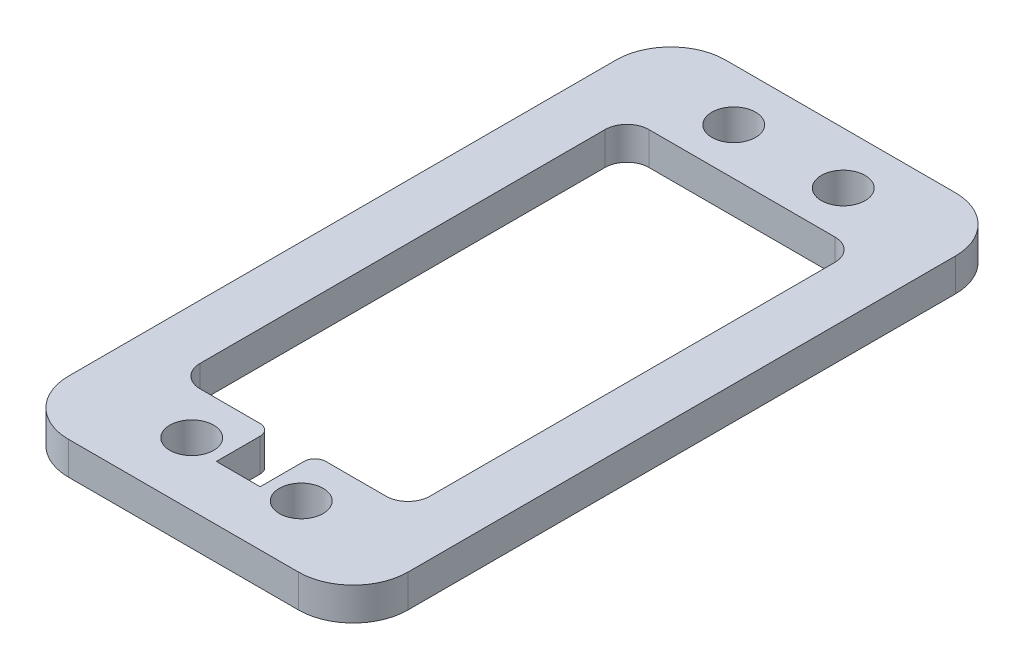
ISO-10303-21;
HEADER;
FILE_DESCRIPTION(('STEP AP214'),'2;1');
FILE_NAME('part.step','',(''),(''),'','','');
FILE_SCHEMA(('AUTOMOTIVE_DESIGN { 1 0 10303 214 1 1 1 1 }'));
ENDSEC;
DATA;
#1=APPLICATION_CONTEXT('core data for automotive mechanical design processes');
#2=APPLICATION_PROTOCOL_DEFINITION('international standard','automotive_design',2000,#1);
#3=PRODUCT_CONTEXT('',#1,'mechanical');
#4=PRODUCT('Part','Part','',(#3));
#5=PRODUCT_RELATED_PRODUCT_CATEGORY('part','',(#4));
#6=PRODUCT_DEFINITION_FORMATION('','',#4);
#7=PRODUCT_DEFINITION_CONTEXT('part definition',#1,'design');
#8=PRODUCT_DEFINITION('design','',#6,#7);
#9=PRODUCT_DEFINITION_SHAPE('','',#8);
#10=(LENGTH_UNIT() NAMED_UNIT(*) SI_UNIT(.MILLI.,.METRE.));
#11=(NAMED_UNIT(*) PLANE_ANGLE_UNIT() SI_UNIT($,.RADIAN.));
#12=(NAMED_UNIT(*) SI_UNIT($,.STERADIAN.) SOLID_ANGLE_UNIT());
#13=UNCERTAINTY_MEASURE_WITH_UNIT(LENGTH_MEASURE(1.E-05),#10,'distance_accuracy_value','');
#14=(GEOMETRIC_REPRESENTATION_CONTEXT(3) GLOBAL_UNCERTAINTY_ASSIGNED_CONTEXT((#13)) GLOBAL_UNIT_ASSIGNED_CONTEXT((#10,
#11,#12)) REPRESENTATION_CONTEXT('',''));
#15=CARTESIAN_POINT('',(0.,0.,0.));
#16=DIRECTION('',(0.,0.,1.));
#17=DIRECTION('',(1.,0.,0.));
#18=AXIS2_PLACEMENT_3D('',#15,#16,#17);
#19=CARTESIAN_POINT('',(-10.5,3.,-34.4));
#20=DIRECTION('',(0.,-1.,0.));
#21=DIRECTION('',(0.,0.,-1.));
#22=AXIS2_PLACEMENT_3D('',#19,#20,#21);
#23=CYLINDRICAL_SURFACE('',#22,5.);
#24=CARTESIAN_POINT('',(-10.5,0.,-34.4));
#25=DIRECTION('',(0.,1.,0.));
#26=DIRECTION('',(0.,0.,1.));
#27=AXIS2_PLACEMENT_3D('',#24,#25,#26);
#28=CIRCLE('',#27,5.);
#29=CARTESIAN_POINT('',(-15.5,0.,-34.4));
#30=VERTEX_POINT('',#29);
#31=CARTESIAN_POINT('',(-10.5,0.,-39.4));
#32=VERTEX_POINT('',#31);
#33=EDGE_CURVE('E274',#30,#32,#28,.F.);
#34=ORIENTED_EDGE('',*,*,#33,.F.);
#35=DIRECTION('',(0.,-1.,0.));
#36=VECTOR('',#35,1.);
#37=CARTESIAN_POINT('',(-15.5,3.,-34.4));
#38=LINE('',#37,#36);
#39=CARTESIAN_POINT('',(-15.5,3.,-34.4));
#40=VERTEX_POINT('',#39);
#41=EDGE_CURVE('E11',#40,#30,#38,.T.);
#42=ORIENTED_EDGE('',*,*,#41,.F.);
#43=CARTESIAN_POINT('',(-10.5,3.,-34.4));
#44=DIRECTION('',(0.,1.,0.));
#45=DIRECTION('',(0.,0.,1.));
#46=AXIS2_PLACEMENT_3D('',#43,#44,#45);
#47=CIRCLE('',#46,5.);
#48=CARTESIAN_POINT('',(-10.5,3.,-39.4));
#49=VERTEX_POINT('',#48);
#50=EDGE_CURVE('E387',#40,#49,#47,.F.);
#51=ORIENTED_EDGE('',*,*,#50,.T.);
#52=DIRECTION('',(0.,-1.,0.));
#53=VECTOR('',#52,1.);
#54=CARTESIAN_POINT('',(-10.5,3.,-39.4));
#55=LINE('',#54,#53);
#56=EDGE_CURVE('E53',#49,#32,#55,.T.);
#57=ORIENTED_EDGE('',*,*,#56,.T.);
#58=EDGE_LOOP('',(#34,#42,#51,#57));
#59=FACE_BOUND('',#58,.T.);
#60=ADVANCED_FACE('F34',(#59),#23,.T.);
#61=CARTESIAN_POINT('',(-15.5,3.,0.));
#62=DIRECTION('',(1.,0.,0.));
#63=DIRECTION('',(0.,0.,-1.));
#64=AXIS2_PLACEMENT_3D('',#61,#62,#63);
#65=PLANE('',#64);
#66=DIRECTION('',(0.,0.,1.));
#67=VECTOR('',#66,1.);
#68=CARTESIAN_POINT('',(-15.5,0.,0.));
#69=LINE('',#68,#67);
#70=CARTESIAN_POINT('',(-15.5,0.,15.6));
#71=VERTEX_POINT('',#70);
#72=EDGE_CURVE('E276',#30,#71,#69,.T.);
#73=ORIENTED_EDGE('',*,*,#72,.T.);
#74=DIRECTION('',(0.,-1.,0.));
#75=VECTOR('',#74,1.);
#76=CARTESIAN_POINT('',(-15.5,3.,15.6));
#77=LINE('',#76,#75);
#78=CARTESIAN_POINT('',(-15.5,3.,15.6));
#79=VERTEX_POINT('',#78);
#80=EDGE_CURVE('E44',#79,#71,#77,.T.);
#81=ORIENTED_EDGE('',*,*,#80,.F.);
#82=DIRECTION('',(0.,0.,1.));
#83=VECTOR('',#82,1.);
#84=CARTESIAN_POINT('',(-15.5,3.,0.));
#85=LINE('',#84,#83);
#86=EDGE_CURVE('E389',#40,#79,#85,.T.);
#87=ORIENTED_EDGE('',*,*,#86,.F.);
#88=ORIENTED_EDGE('',*,*,#41,.T.);
#89=EDGE_LOOP('',(#73,#81,#87,#88));
#90=FACE_BOUND('',#89,.T.);
#91=ADVANCED_FACE('F416',(#90),#65,.F.);
#92=CARTESIAN_POINT('',(-10.5,3.,15.6));
#93=DIRECTION('',(0.,-1.,0.));
#94=DIRECTION('',(0.,0.,-1.));
#95=AXIS2_PLACEMENT_3D('',#92,#93,#94);
#96=CYLINDRICAL_SURFACE('',#95,5.);
#97=CARTESIAN_POINT('',(-10.5,0.,15.6));
#98=DIRECTION('',(0.,1.,0.));
#99=DIRECTION('',(0.,0.,1.));
#100=AXIS2_PLACEMENT_3D('',#97,#98,#99);
#101=CIRCLE('',#100,5.);
#102=CARTESIAN_POINT('',(-10.5,0.,20.6));
#103=VERTEX_POINT('',#102);
#104=EDGE_CURVE('E279',#71,#103,#101,.T.);
#105=ORIENTED_EDGE('',*,*,#104,.T.);
#106=DIRECTION('',(0.,-1.,0.));
#107=VECTOR('',#106,1.);
#108=CARTESIAN_POINT('',(-10.5,3.,20.6));
#109=LINE('',#108,#107);
#110=CARTESIAN_POINT('',(-10.5,3.,20.6));
#111=VERTEX_POINT('',#110);
#112=EDGE_CURVE('E300',#111,#103,#109,.T.);
#113=ORIENTED_EDGE('',*,*,#112,.F.);
#114=CARTESIAN_POINT('',(-10.5,3.,15.6));
#115=DIRECTION('',(0.,1.,0.));
#116=DIRECTION('',(0.,0.,1.));
#117=AXIS2_PLACEMENT_3D('',#114,#115,#116);
#118=CIRCLE('',#117,5.);
#119=EDGE_CURVE('E392',#79,#111,#118,.T.);
#120=ORIENTED_EDGE('',*,*,#119,.F.);
#121=ORIENTED_EDGE('',*,*,#80,.T.);
#122=EDGE_LOOP('',(#105,#113,#120,#121));
#123=FACE_BOUND('',#122,.T.);
#124=ADVANCED_FACE('F421',(#123),#96,.T.);
#125=CARTESIAN_POINT('',(0.,3.,20.6));
#126=DIRECTION('',(0.,0.,-1.));
#127=DIRECTION('',(-1.,0.,0.));
#128=AXIS2_PLACEMENT_3D('',#125,#126,#127);
#129=PLANE('',#128);
#130=DIRECTION('',(1.,0.,0.));
#131=VECTOR('',#130,1.);
#132=CARTESIAN_POINT('',(0.,0.,20.6));
#133=LINE('',#132,#131);
#134=CARTESIAN_POINT('',(10.5,0.,20.6));
#135=VERTEX_POINT('',#134);
#136=EDGE_CURVE('E282',#103,#135,#133,.T.);
#137=ORIENTED_EDGE('',*,*,#136,.T.);
#138=DIRECTION('',(0.,-1.,0.));
#139=VECTOR('',#138,1.);
#140=CARTESIAN_POINT('',(10.5,3.,20.6));
#141=LINE('',#140,#139);
#142=CARTESIAN_POINT('',(10.5,3.,20.6));
#143=VERTEX_POINT('',#142);
#144=EDGE_CURVE('E298',#143,#135,#141,.T.);
#145=ORIENTED_EDGE('',*,*,#144,.F.);
#146=DIRECTION('',(1.,0.,0.));
#147=VECTOR('',#146,1.);
#148=CARTESIAN_POINT('',(0.,3.,20.6));
#149=LINE('',#148,#147);
#150=EDGE_CURVE('E214',#111,#143,#149,.T.);
#151=ORIENTED_EDGE('',*,*,#150,.F.);
#152=ORIENTED_EDGE('',*,*,#112,.T.);
#153=EDGE_LOOP('',(#137,#145,#151,#152));
#154=FACE_BOUND('',#153,.T.);
#155=ADVANCED_FACE('F397',(#154),#129,.F.);
#156=CARTESIAN_POINT('',(10.5,3.,15.6));
#157=DIRECTION('',(0.,-1.,0.));
#158=DIRECTION('',(0.,0.,-1.));
#159=AXIS2_PLACEMENT_3D('',#156,#157,#158);
#160=CYLINDRICAL_SURFACE('',#159,5.);
#161=CARTESIAN_POINT('',(10.5,0.,15.6));
#162=DIRECTION('',(0.,1.,0.));
#163=DIRECTION('',(0.,0.,1.));
#164=AXIS2_PLACEMENT_3D('',#161,#162,#163);
#165=CIRCLE('',#164,5.);
#166=CARTESIAN_POINT('',(15.5,0.,15.6));
#167=VERTEX_POINT('',#166);
#168=EDGE_CURVE('E285',#167,#135,#165,.F.);
#169=ORIENTED_EDGE('',*,*,#168,.F.);
#170=DIRECTION('',(0.,-1.,0.));
#171=VECTOR('',#170,1.);
#172=CARTESIAN_POINT('',(15.5,3.,15.6));
#173=LINE('',#172,#171);
#174=CARTESIAN_POINT('',(15.5,3.,15.6));
#175=VERTEX_POINT('',#174);
#176=EDGE_CURVE('E200',#175,#167,#173,.T.);
#177=ORIENTED_EDGE('',*,*,#176,.F.);
#178=CARTESIAN_POINT('',(10.5,3.,15.6));
#179=DIRECTION('',(0.,1.,0.));
#180=DIRECTION('',(0.,0.,1.));
#181=AXIS2_PLACEMENT_3D('',#178,#179,#180);
#182=CIRCLE('',#181,5.);
#183=EDGE_CURVE('E212',#175,#143,#182,.F.);
#184=ORIENTED_EDGE('',*,*,#183,.T.);
#185=ORIENTED_EDGE('',*,*,#144,.T.);
#186=EDGE_LOOP('',(#169,#177,#184,#185));
#187=FACE_BOUND('',#186,.T.);
#188=ADVANCED_FACE('F400',(#187),#160,.T.);
#189=CARTESIAN_POINT('',(15.5,3.,0.));
#190=DIRECTION('',(1.,0.,0.));
#191=DIRECTION('',(0.,0.,-1.));
#192=AXIS2_PLACEMENT_3D('',#189,#190,#191);
#193=PLANE('',#192);
#194=DIRECTION('',(0.,0.,1.));
#195=VECTOR('',#194,1.);
#196=CARTESIAN_POINT('',(15.5,0.,0.));
#197=LINE('',#196,#195);
#198=CARTESIAN_POINT('',(15.5,0.,-34.4));
#199=VERTEX_POINT('',#198);
#200=EDGE_CURVE('E197',#199,#167,#197,.T.);
#201=ORIENTED_EDGE('',*,*,#200,.F.);
#202=DIRECTION('',(0.,-1.,0.));
#203=VECTOR('',#202,1.);
#204=CARTESIAN_POINT('',(15.5,3.,-34.4));
#205=LINE('',#204,#203);
#206=CARTESIAN_POINT('',(15.5,3.,-34.4));
#207=VERTEX_POINT('',#206);
#208=EDGE_CURVE('E191',#207,#199,#205,.T.);
#209=ORIENTED_EDGE('',*,*,#208,.F.);
#210=DIRECTION('',(0.,0.,1.));
#211=VECTOR('',#210,1.);
#212=CARTESIAN_POINT('',(15.5,3.,0.));
#213=LINE('',#212,#211);
#214=EDGE_CURVE('E195',#207,#175,#213,.T.);
#215=ORIENTED_EDGE('',*,*,#214,.T.);
#216=ORIENTED_EDGE('',*,*,#176,.T.);
#217=EDGE_LOOP('',(#201,#209,#215,#216));
#218=FACE_BOUND('',#217,.T.);
#219=ADVANCED_FACE('F193',(#218),#193,.T.);
#220=CARTESIAN_POINT('',(10.5,3.,-34.4));
#221=DIRECTION('',(0.,-1.,0.));
#222=DIRECTION('',(0.,0.,-1.));
#223=AXIS2_PLACEMENT_3D('',#220,#221,#222);
#224=CYLINDRICAL_SURFACE('',#223,5.);
#225=CARTESIAN_POINT('',(10.5,0.,-34.4));
#226=DIRECTION('',(0.,1.,0.));
#227=DIRECTION('',(0.,0.,1.));
#228=AXIS2_PLACEMENT_3D('',#225,#226,#227);
#229=CIRCLE('',#228,5.);
#230=CARTESIAN_POINT('',(10.5,0.,-39.4));
#231=VERTEX_POINT('',#230);
#232=EDGE_CURVE('E289',#199,#231,#229,.T.);
#233=ORIENTED_EDGE('',*,*,#232,.T.);
#234=DIRECTION('',(0.,-1.,0.));
#235=VECTOR('',#234,1.);
#236=CARTESIAN_POINT('',(10.5,3.,-39.4));
#237=LINE('',#236,#235);
#238=CARTESIAN_POINT('',(10.5,3.,-39.4));
#239=VERTEX_POINT('',#238);
#240=EDGE_CURVE('E121',#239,#231,#237,.T.);
#241=ORIENTED_EDGE('',*,*,#240,.F.);
#242=CARTESIAN_POINT('',(10.5,3.,-34.4));
#243=DIRECTION('',(0.,1.,0.));
#244=DIRECTION('',(0.,0.,1.));
#245=AXIS2_PLACEMENT_3D('',#242,#243,#244);
#246=CIRCLE('',#245,5.);
#247=EDGE_CURVE('E202',#207,#239,#246,.T.);
#248=ORIENTED_EDGE('',*,*,#247,.F.);
#249=ORIENTED_EDGE('',*,*,#208,.T.);
#250=EDGE_LOOP('',(#233,#241,#248,#249));
#251=FACE_BOUND('',#250,.T.);
#252=ADVANCED_FACE('F203',(#251),#224,.T.);
#253=CARTESIAN_POINT('',(-3.,3.,11.6));
#254=DIRECTION('',(0.,-1.,0.));
#255=DIRECTION('',(0.,0.,-1.));
#256=AXIS2_PLACEMENT_3D('',#253,#254,#255);
#257=CYLINDRICAL_SURFACE('',#256,0.999999999999999);
#258=CARTESIAN_POINT('',(-3.,0.,11.6));
#259=DIRECTION('',(0.,1.,0.));
#260=DIRECTION('',(0.,0.,1.));
#261=AXIS2_PLACEMENT_3D('',#258,#259,#260);
#262=CIRCLE('',#261,0.999999999999999);
#263=CARTESIAN_POINT('',(-3.,0.,10.6));
#264=VERTEX_POINT('',#263);
#265=CARTESIAN_POINT('',(-2.,0.,11.6));
#266=VERTEX_POINT('',#265);
#267=EDGE_CURVE('E232',#264,#266,#262,.F.);
#268=ORIENTED_EDGE('',*,*,#267,.F.);
#269=DIRECTION('',(0.,-1.,0.));
#270=VECTOR('',#269,1.);
#271=CARTESIAN_POINT('',(-3.,3.,10.6));
#272=LINE('',#271,#270);
#273=CARTESIAN_POINT('',(-3.,3.,10.6));
#274=VERTEX_POINT('',#273);
#275=EDGE_CURVE('E38',#274,#264,#272,.T.);
#276=ORIENTED_EDGE('',*,*,#275,.F.);
#277=CARTESIAN_POINT('',(-3.,3.,11.6));
#278=DIRECTION('',(0.,1.,0.));
#279=DIRECTION('',(0.,0.,1.));
#280=AXIS2_PLACEMENT_3D('',#277,#278,#279);
#281=CIRCLE('',#280,0.999999999999999);
#282=CARTESIAN_POINT('',(-2.,3.,11.6));
#283=VERTEX_POINT('',#282);
#284=EDGE_CURVE('E685',#274,#283,#281,.F.);
#285=ORIENTED_EDGE('',*,*,#284,.T.);
#286=DIRECTION('',(0.,-1.,0.));
#287=VECTOR('',#286,1.);
#288=CARTESIAN_POINT('',(-2.,3.,11.6));
#289=LINE('',#288,#287);
#290=EDGE_CURVE('E219',#283,#266,#289,.T.);
#291=ORIENTED_EDGE('',*,*,#290,.T.);
#292=EDGE_LOOP('',(#268,#276,#285,#291));
#293=FACE_BOUND('',#292,.T.);
#294=ADVANCED_FACE('F339',(#293),#257,.T.);
#295=CARTESIAN_POINT('',(0.,3.,10.6));
#296=DIRECTION('',(0.,0.,-1.));
#297=DIRECTION('',(-1.,0.,0.));
#298=AXIS2_PLACEMENT_3D('',#295,#296,#297);
#299=PLANE('',#298);
#300=DIRECTION('',(1.,0.,0.));
#301=VECTOR('',#300,1.);
#302=CARTESIAN_POINT('',(0.,0.,10.6));
#303=LINE('',#302,#301);
#304=CARTESIAN_POINT('',(-8.49999999999999,0.,10.6));
#305=VERTEX_POINT('',#304);
#306=EDGE_CURVE('E235',#305,#264,#303,.T.);
#307=ORIENTED_EDGE('',*,*,#306,.F.);
#308=DIRECTION('',(0.,-1.,0.));
#309=VECTOR('',#308,1.);
#310=CARTESIAN_POINT('',(-8.49999999999999,3.,10.6));
#311=LINE('',#310,#309);
#312=CARTESIAN_POINT('',(-8.49999999999999,3.,10.6));
#313=VERTEX_POINT('',#312);
#314=EDGE_CURVE('E329',#313,#305,#311,.T.);
#315=ORIENTED_EDGE('',*,*,#314,.F.);
#316=DIRECTION('',(1.,0.,0.));
#317=VECTOR('',#316,1.);
#318=CARTESIAN_POINT('',(0.,3.,10.6));
#319=LINE('',#318,#317);
#320=EDGE_CURVE('E338',#313,#274,#319,.T.);
#321=ORIENTED_EDGE('',*,*,#320,.T.);
#322=ORIENTED_EDGE('',*,*,#275,.T.);
#323=EDGE_LOOP('',(#307,#315,#321,#322));
#324=FACE_BOUND('',#323,.T.);
#325=ADVANCED_FACE('F336',(#324),#299,.T.);
#326=CARTESIAN_POINT('',(-8.5,3.,8.6));
#327=DIRECTION('',(0.,-1.,0.));
#328=DIRECTION('',(0.,0.,-1.));
#329=AXIS2_PLACEMENT_3D('',#326,#327,#328);
#330=CYLINDRICAL_SURFACE('',#329,2.);
#331=CARTESIAN_POINT('',(-8.5,0.,8.6));
#332=DIRECTION('',(0.,1.,0.));
#333=DIRECTION('',(0.,0.,1.));
#334=AXIS2_PLACEMENT_3D('',#331,#332,#333);
#335=CIRCLE('',#334,2.);
#336=CARTESIAN_POINT('',(-10.5,0.,8.59999999999999));
#337=VERTEX_POINT('',#336);
#338=EDGE_CURVE('E238',#337,#305,#335,.T.);
#339=ORIENTED_EDGE('',*,*,#338,.F.);
#340=DIRECTION('',(0.,-1.,0.));
#341=VECTOR('',#340,1.);
#342=CARTESIAN_POINT('',(-10.5,3.,8.59999999999999));
#343=LINE('',#342,#341);
#344=CARTESIAN_POINT('',(-10.5,3.,8.59999999999999));
#345=VERTEX_POINT('',#344);
#346=EDGE_CURVE('E328',#345,#337,#343,.T.);
#347=ORIENTED_EDGE('',*,*,#346,.F.);
#348=CARTESIAN_POINT('',(-8.5,3.,8.6));
#349=DIRECTION('',(0.,1.,0.));
#350=DIRECTION('',(0.,0.,1.));
#351=AXIS2_PLACEMENT_3D('',#348,#349,#350);
#352=CIRCLE('',#351,2.);
#353=EDGE_CURVE('E348',#345,#313,#352,.T.);
#354=ORIENTED_EDGE('',*,*,#353,.T.);
#355=ORIENTED_EDGE('',*,*,#314,.T.);
#356=EDGE_LOOP('',(#339,#347,#354,#355));
#357=FACE_BOUND('',#356,.T.);
#358=ADVANCED_FACE('F346',(#357),#330,.F.);
#359=CARTESIAN_POINT('',(-10.5,3.,0.));
#360=DIRECTION('',(1.,0.,0.));
#361=DIRECTION('',(0.,0.,-1.));
#362=AXIS2_PLACEMENT_3D('',#359,#360,#361);
#363=PLANE('',#362);
#364=DIRECTION('',(0.,0.,1.));
#365=VECTOR('',#364,1.);
#366=CARTESIAN_POINT('',(-10.5,0.,0.));
#367=LINE('',#366,#365);
#368=CARTESIAN_POINT('',(-10.5,0.,-28.4));
#369=VERTEX_POINT('',#368);
#370=EDGE_CURVE('E241',#369,#337,#367,.T.);
#371=ORIENTED_EDGE('',*,*,#370,.F.);
#372=DIRECTION('',(0.,-1.,0.));
#373=VECTOR('',#372,1.);
#374=CARTESIAN_POINT('',(-10.5,3.,-28.4));
#375=LINE('',#374,#373);
#376=CARTESIAN_POINT('',(-10.5,3.,-28.4));
#377=VERTEX_POINT('',#376);
#378=EDGE_CURVE('E326',#377,#369,#375,.T.);
#379=ORIENTED_EDGE('',*,*,#378,.F.);
#380=DIRECTION('',(0.,0.,1.));
#381=VECTOR('',#380,1.);
#382=CARTESIAN_POINT('',(-10.5,3.,0.));
#383=LINE('',#382,#381);
#384=EDGE_CURVE('E354',#377,#345,#383,.T.);
#385=ORIENTED_EDGE('',*,*,#384,.T.);
#386=ORIENTED_EDGE('',*,*,#346,.T.);
#387=EDGE_LOOP('',(#371,#379,#385,#386));
#388=FACE_BOUND('',#387,.T.);
#389=ADVANCED_FACE('F356',(#388),#363,.T.);
#390=CARTESIAN_POINT('',(-8.5,3.,-28.4));
#391=DIRECTION('',(0.,-1.,0.));
#392=DIRECTION('',(0.,0.,-1.));
#393=AXIS2_PLACEMENT_3D('',#390,#391,#392);
#394=CYLINDRICAL_SURFACE('',#393,2.);
#395=CARTESIAN_POINT('',(-8.5,0.,-28.4));
#396=DIRECTION('',(0.,1.,0.));
#397=DIRECTION('',(0.,0.,1.));
#398=AXIS2_PLACEMENT_3D('',#395,#396,#397);
#399=CIRCLE('',#398,2.);
#400=CARTESIAN_POINT('',(-8.49999999999999,0.,-30.4));
#401=VERTEX_POINT('',#400);
#402=EDGE_CURVE('E244',#369,#401,#399,.F.);
#403=ORIENTED_EDGE('',*,*,#402,.T.);
#404=DIRECTION('',(0.,-1.,0.));
#405=VECTOR('',#404,1.);
#406=CARTESIAN_POINT('',(-8.49999999999999,3.,-30.4));
#407=LINE('',#406,#405);
#408=CARTESIAN_POINT('',(-8.49999999999999,3.,-30.4));
#409=VERTEX_POINT('',#408);
#410=EDGE_CURVE('E323',#409,#401,#407,.T.);
#411=ORIENTED_EDGE('',*,*,#410,.F.);
#412=CARTESIAN_POINT('',(-8.5,3.,-28.4));
#413=DIRECTION('',(0.,1.,0.));
#414=DIRECTION('',(0.,0.,1.));
#415=AXIS2_PLACEMENT_3D('',#412,#413,#414);
#416=CIRCLE('',#415,2.);
#417=EDGE_CURVE('E358',#377,#409,#416,.F.);
#418=ORIENTED_EDGE('',*,*,#417,.F.);
#419=ORIENTED_EDGE('',*,*,#378,.T.);
#420=EDGE_LOOP('',(#403,#411,#418,#419));
#421=FACE_BOUND('',#420,.T.);
#422=ADVANCED_FACE('F462',(#421),#394,.F.);
#423=CARTESIAN_POINT('',(0.,3.,-30.4));
#424=DIRECTION('',(0.,0.,-1.));
#425=DIRECTION('',(-1.,0.,0.));
#426=AXIS2_PLACEMENT_3D('',#423,#424,#425);
#427=PLANE('',#426);
#428=DIRECTION('',(1.,0.,0.));
#429=VECTOR('',#428,1.);
#430=CARTESIAN_POINT('',(0.,0.,-30.4));
#431=LINE('',#430,#429);
#432=CARTESIAN_POINT('',(8.49999999999998,0.,-30.4));
#433=VERTEX_POINT('',#432);
#434=EDGE_CURVE('E247',#401,#433,#431,.T.);
#435=ORIENTED_EDGE('',*,*,#434,.T.);
#436=DIRECTION('',(0.,-1.,0.));
#437=VECTOR('',#436,1.);
#438=CARTESIAN_POINT('',(8.49999999999998,3.,-30.4));
#439=LINE('',#438,#437);
#440=CARTESIAN_POINT('',(8.49999999999998,3.,-30.4));
#441=VERTEX_POINT('',#440);
#442=EDGE_CURVE('E321',#441,#433,#439,.T.);
#443=ORIENTED_EDGE('',*,*,#442,.F.);
#444=DIRECTION('',(1.,0.,0.));
#445=VECTOR('',#444,1.);
#446=CARTESIAN_POINT('',(0.,3.,-30.4));
#447=LINE('',#446,#445);
#448=EDGE_CURVE('E360',#409,#441,#447,.T.);
#449=ORIENTED_EDGE('',*,*,#448,.F.);
#450=ORIENTED_EDGE('',*,*,#410,.T.);
#451=EDGE_LOOP('',(#435,#443,#449,#450));
#452=FACE_BOUND('',#451,.T.);
#453=ADVANCED_FACE('F458',(#452),#427,.F.);
#454=CARTESIAN_POINT('',(8.5,3.,-28.4));
#455=DIRECTION('',(0.,-1.,0.));
#456=DIRECTION('',(0.,0.,-1.));
#457=AXIS2_PLACEMENT_3D('',#454,#455,#456);
#458=CYLINDRICAL_SURFACE('',#457,2.);
#459=CARTESIAN_POINT('',(8.5,0.,-28.4));
#460=DIRECTION('',(0.,1.,0.));
#461=DIRECTION('',(0.,0.,1.));
#462=AXIS2_PLACEMENT_3D('',#459,#460,#461);
#463=CIRCLE('',#462,2.);
#464=CARTESIAN_POINT('',(10.5,0.,-28.4));
#465=VERTEX_POINT('',#464);
#466=EDGE_CURVE('E250',#465,#433,#463,.T.);
#467=ORIENTED_EDGE('',*,*,#466,.F.);
#468=DIRECTION('',(0.,-1.,0.));
#469=VECTOR('',#468,1.);
#470=CARTESIAN_POINT('',(10.5,3.,-28.4));
#471=LINE('',#470,#469);
#472=CARTESIAN_POINT('',(10.5,3.,-28.4));
#473=VERTEX_POINT('',#472);
#474=EDGE_CURVE('E319',#473,#465,#471,.T.);
#475=ORIENTED_EDGE('',*,*,#474,.F.);
#476=CARTESIAN_POINT('',(8.5,3.,-28.4));
#477=DIRECTION('',(0.,1.,0.));
#478=DIRECTION('',(0.,0.,1.));
#479=AXIS2_PLACEMENT_3D('',#476,#477,#478);
#480=CIRCLE('',#479,2.);
#481=EDGE_CURVE('E365',#473,#441,#480,.T.);
#482=ORIENTED_EDGE('',*,*,#481,.T.);
#483=ORIENTED_EDGE('',*,*,#442,.T.);
#484=EDGE_LOOP('',(#467,#475,#482,#483));
#485=FACE_BOUND('',#484,.T.);
#486=ADVANCED_FACE('F454',(#485),#458,.F.);
#487=CARTESIAN_POINT('',(10.5,3.,0.));
#488=DIRECTION('',(1.,0.,0.));
#489=DIRECTION('',(0.,0.,-1.));
#490=AXIS2_PLACEMENT_3D('',#487,#488,#489);
#491=PLANE('',#490);
#492=DIRECTION('',(0.,0.,1.));
#493=VECTOR('',#492,1.);
#494=CARTESIAN_POINT('',(10.5,0.,0.));
#495=LINE('',#494,#493);
#496=CARTESIAN_POINT('',(10.5,0.,8.59999999999999));
#497=VERTEX_POINT('',#496);
#498=EDGE_CURVE('E253',#465,#497,#495,.T.);
#499=ORIENTED_EDGE('',*,*,#498,.T.);
#500=DIRECTION('',(0.,-1.,0.));
#501=VECTOR('',#500,1.);
#502=CARTESIAN_POINT('',(10.5,3.,8.59999999999999));
#503=LINE('',#502,#501);
#504=CARTESIAN_POINT('',(10.5,3.,8.59999999999999));
#505=VERTEX_POINT('',#504);
#506=EDGE_CURVE('E317',#505,#497,#503,.T.);
#507=ORIENTED_EDGE('',*,*,#506,.F.);
#508=DIRECTION('',(0.,0.,1.));
#509=VECTOR('',#508,1.);
#510=CARTESIAN_POINT('',(10.5,3.,0.));
#511=LINE('',#510,#509);
#512=EDGE_CURVE('E368',#473,#505,#511,.T.);
#513=ORIENTED_EDGE('',*,*,#512,.F.);
#514=ORIENTED_EDGE('',*,*,#474,.T.);
#515=EDGE_LOOP('',(#499,#507,#513,#514));
#516=FACE_BOUND('',#515,.T.);
#517=ADVANCED_FACE('F450',(#516),#491,.F.);
#518=CARTESIAN_POINT('',(8.5,3.,8.6));
#519=DIRECTION('',(0.,-1.,0.));
#520=DIRECTION('',(0.,0.,-1.));
#521=AXIS2_PLACEMENT_3D('',#518,#519,#520);
#522=CYLINDRICAL_SURFACE('',#521,2.);
#523=CARTESIAN_POINT('',(8.5,0.,8.6));
#524=DIRECTION('',(0.,1.,0.));
#525=DIRECTION('',(0.,0.,1.));
#526=AXIS2_PLACEMENT_3D('',#523,#524,#525);
#527=CIRCLE('',#526,2.);
#528=CARTESIAN_POINT('',(8.49999999999999,0.,10.6));
#529=VERTEX_POINT('',#528);
#530=EDGE_CURVE('E256',#529,#497,#527,.T.);
#531=ORIENTED_EDGE('',*,*,#530,.F.);
#532=DIRECTION('',(0.,-1.,0.));
#533=VECTOR('',#532,1.);
#534=CARTESIAN_POINT('',(8.49999999999999,3.,10.6));
#535=LINE('',#534,#533);
#536=CARTESIAN_POINT('',(8.49999999999999,3.,10.6));
#537=VERTEX_POINT('',#536);
#538=EDGE_CURVE('E315',#537,#529,#535,.T.);
#539=ORIENTED_EDGE('',*,*,#538,.F.);
#540=CARTESIAN_POINT('',(8.5,3.,8.6));
#541=DIRECTION('',(0.,1.,0.));
#542=DIRECTION('',(0.,0.,1.));
#543=AXIS2_PLACEMENT_3D('',#540,#541,#542);
#544=CIRCLE('',#543,2.);
#545=EDGE_CURVE('E370',#537,#505,#544,.T.);
#546=ORIENTED_EDGE('',*,*,#545,.T.);
#547=ORIENTED_EDGE('',*,*,#506,.T.);
#548=EDGE_LOOP('',(#531,#539,#546,#547));
#549=FACE_BOUND('',#548,.T.);
#550=ADVANCED_FACE('F446',(#549),#522,.F.);
#551=CARTESIAN_POINT('',(0.,3.,10.6));
#552=DIRECTION('',(0.,0.,-1.));
#553=DIRECTION('',(-1.,0.,0.));
#554=AXIS2_PLACEMENT_3D('',#551,#552,#553);
#555=PLANE('',#554);
#556=DIRECTION('',(1.,0.,0.));
#557=VECTOR('',#556,1.);
#558=CARTESIAN_POINT('',(0.,0.,10.6));
#559=LINE('',#558,#557);
#560=CARTESIAN_POINT('',(3.,0.,10.6));
#561=VERTEX_POINT('',#560);
#562=EDGE_CURVE('E259',#561,#529,#559,.T.);
#563=ORIENTED_EDGE('',*,*,#562,.F.);
#564=DIRECTION('',(0.,-1.,0.));
#565=VECTOR('',#564,1.);
#566=CARTESIAN_POINT('',(3.,3.,10.6));
#567=LINE('',#566,#565);
#568=CARTESIAN_POINT('',(3.,3.,10.6));
#569=VERTEX_POINT('',#568);
#570=EDGE_CURVE('E313',#569,#561,#567,.T.);
#571=ORIENTED_EDGE('',*,*,#570,.F.);
#572=DIRECTION('',(1.,0.,0.));
#573=VECTOR('',#572,1.);
#574=CARTESIAN_POINT('',(0.,3.,10.6));
#575=LINE('',#574,#573);
#576=EDGE_CURVE('E373',#569,#537,#575,.T.);
#577=ORIENTED_EDGE('',*,*,#576,.T.);
#578=ORIENTED_EDGE('',*,*,#538,.T.);
#579=EDGE_LOOP('',(#563,#571,#577,#578));
#580=FACE_BOUND('',#579,.T.);
#581=ADVANCED_FACE('F442',(#580),#555,.T.);
#582=CARTESIAN_POINT('',(3.,3.,11.6));
#583=DIRECTION('',(0.,-1.,0.));
#584=DIRECTION('',(0.,0.,-1.));
#585=AXIS2_PLACEMENT_3D('',#582,#583,#584);
#586=CYLINDRICAL_SURFACE('',#585,0.999999999999999);
#587=CARTESIAN_POINT('',(3.,0.,11.6));
#588=DIRECTION('',(0.,1.,0.));
#589=DIRECTION('',(0.,0.,1.));
#590=AXIS2_PLACEMENT_3D('',#587,#588,#589);
#591=CIRCLE('',#590,0.999999999999999);
#592=CARTESIAN_POINT('',(2.,0.,11.6));
#593=VERTEX_POINT('',#592);
#594=EDGE_CURVE('E262',#561,#593,#591,.T.);
#595=ORIENTED_EDGE('',*,*,#594,.T.);
#596=DIRECTION('',(0.,-1.,0.));
#597=VECTOR('',#596,1.);
#598=CARTESIAN_POINT('',(2.,3.,11.6));
#599=LINE('',#598,#597);
#600=CARTESIAN_POINT('',(2.,3.,11.6));
#601=VERTEX_POINT('',#600);
#602=EDGE_CURVE('E310',#601,#593,#599,.T.);
#603=ORIENTED_EDGE('',*,*,#602,.F.);
#604=CARTESIAN_POINT('',(3.,3.,11.6));
#605=DIRECTION('',(0.,1.,0.));
#606=DIRECTION('',(0.,0.,1.));
#607=AXIS2_PLACEMENT_3D('',#604,#605,#606);
#608=CIRCLE('',#607,0.999999999999999);
#609=EDGE_CURVE('E376',#569,#601,#608,.T.);
#610=ORIENTED_EDGE('',*,*,#609,.F.);
#611=ORIENTED_EDGE('',*,*,#570,.T.);
#612=EDGE_LOOP('',(#595,#603,#610,#611));
#613=FACE_BOUND('',#612,.T.);
#614=ADVANCED_FACE('F438',(#613),#586,.T.);
#615=CARTESIAN_POINT('',(2.,3.,0.));
#616=DIRECTION('',(1.,0.,0.));
#617=DIRECTION('',(0.,0.,-1.));
#618=AXIS2_PLACEMENT_3D('',#615,#616,#617);
#619=PLANE('',#618);
#620=DIRECTION('',(0.,0.,1.));
#621=VECTOR('',#620,1.);
#622=CARTESIAN_POINT('',(2.,0.,0.));
#623=LINE('',#622,#621);
#624=CARTESIAN_POINT('',(2.,0.,15.6));
#625=VERTEX_POINT('',#624);
#626=EDGE_CURVE('E265',#593,#625,#623,.T.);
#627=ORIENTED_EDGE('',*,*,#626,.T.);
#628=DIRECTION('',(0.,-1.,0.));
#629=VECTOR('',#628,1.);
#630=CARTESIAN_POINT('',(2.,3.,15.6));
#631=LINE('',#630,#629);
#632=CARTESIAN_POINT('',(2.,3.,15.6));
#633=VERTEX_POINT('',#632);
#634=EDGE_CURVE('E308',#633,#625,#631,.T.);
#635=ORIENTED_EDGE('',*,*,#634,.F.);
#636=DIRECTION('',(0.,0.,1.));
#637=VECTOR('',#636,1.);
#638=CARTESIAN_POINT('',(2.,3.,0.));
#639=LINE('',#638,#637);
#640=EDGE_CURVE('E379',#601,#633,#639,.T.);
#641=ORIENTED_EDGE('',*,*,#640,.F.);
#642=ORIENTED_EDGE('',*,*,#602,.T.);
#643=EDGE_LOOP('',(#627,#635,#641,#642));
#644=FACE_BOUND('',#643,.T.);
#645=ADVANCED_FACE('F434',(#644),#619,.F.);
#646=CARTESIAN_POINT('',(0.,3.,15.6));
#647=DIRECTION('',(0.,0.,-1.));
#648=DIRECTION('',(-1.,0.,0.));
#649=AXIS2_PLACEMENT_3D('',#646,#647,#648);
#650=PLANE('',#649);
#651=DIRECTION('',(1.,0.,0.));
#652=VECTOR('',#651,1.);
#653=CARTESIAN_POINT('',(0.,0.,15.6));
#654=LINE('',#653,#652);
#655=CARTESIAN_POINT('',(-2.,0.,15.6));
#656=VERTEX_POINT('',#655);
#657=EDGE_CURVE('E268',#656,#625,#654,.T.);
#658=ORIENTED_EDGE('',*,*,#657,.F.);
#659=DIRECTION('',(0.,-1.,0.));
#660=VECTOR('',#659,1.);
#661=CARTESIAN_POINT('',(-2.,3.,15.6));
#662=LINE('',#661,#660);
#663=CARTESIAN_POINT('',(-2.,3.,15.6));
#664=VERTEX_POINT('',#663);
#665=EDGE_CURVE('E306',#664,#656,#662,.T.);
#666=ORIENTED_EDGE('',*,*,#665,.F.);
#667=DIRECTION('',(1.,0.,0.));
#668=VECTOR('',#667,1.);
#669=CARTESIAN_POINT('',(0.,3.,15.6));
#670=LINE('',#669,#668);
#671=EDGE_CURVE('E381',#664,#633,#670,.T.);
#672=ORIENTED_EDGE('',*,*,#671,.T.);
#673=ORIENTED_EDGE('',*,*,#634,.T.);
#674=EDGE_LOOP('',(#658,#666,#672,#673));
#675=FACE_BOUND('',#674,.T.);
#676=ADVANCED_FACE('F430',(#675),#650,.T.);
#677=CARTESIAN_POINT('',(-2.,3.,0.));
#678=DIRECTION('',(1.,0.,0.));
#679=DIRECTION('',(0.,0.,-1.));
#680=AXIS2_PLACEMENT_3D('',#677,#678,#679);
#681=PLANE('',#680);
#682=DIRECTION('',(0.,0.,1.));
#683=VECTOR('',#682,1.);
#684=CARTESIAN_POINT('',(-2.,0.,0.));
#685=LINE('',#684,#683);
#686=EDGE_CURVE('E271',#266,#656,#685,.T.);
#687=ORIENTED_EDGE('',*,*,#686,.F.);
#688=ORIENTED_EDGE('',*,*,#290,.F.);
#689=DIRECTION('',(0.,0.,1.));
#690=VECTOR('',#689,1.);
#691=CARTESIAN_POINT('',(-2.,3.,0.));
#692=LINE('',#691,#690);
#693=EDGE_CURVE('E384',#283,#664,#692,.T.);
#694=ORIENTED_EDGE('',*,*,#693,.T.);
#695=ORIENTED_EDGE('',*,*,#665,.T.);
#696=EDGE_LOOP('',(#687,#688,#694,#695));
#697=FACE_BOUND('',#696,.T.);
#698=ADVANCED_FACE('F426',(#697),#681,.T.);
#699=CARTESIAN_POINT('',(-5.,3.,-34.65));
#700=DIRECTION('',(0.,-1.,0.));
#701=DIRECTION('',(0.,0.,-1.));
#702=AXIS2_PLACEMENT_3D('',#699,#700,#701);
#703=CYLINDRICAL_SURFACE('',#702,2.);
#704=CARTESIAN_POINT('',(-5.,3.,-34.65));
#705=DIRECTION('',(0.,1.,0.));
#706=DIRECTION('',(0.,0.,1.));
#707=AXIS2_PLACEMENT_3D('',#704,#705,#706);
#708=CIRCLE('',#707,2.);
#709=CARTESIAN_POINT('',(-5.,3.,-32.65));
#710=VERTEX_POINT('',#709);
#711=EDGE_CURVE('E678',#710,#710,#708,.T.);
#712=ORIENTED_EDGE('',*,*,#711,.T.);
#713=EDGE_LOOP('',(#712));
#714=FACE_BOUND('',#713,.T.);
#715=CARTESIAN_POINT('',(-5.,0.,-34.65));
#716=DIRECTION('',(0.,1.,0.));
#717=DIRECTION('',(0.,0.,1.));
#718=AXIS2_PLACEMENT_3D('',#715,#716,#717);
#719=CIRCLE('',#718,2.);
#720=CARTESIAN_POINT('',(-5.,0.,-32.65));
#721=VERTEX_POINT('',#720);
#722=EDGE_CURVE('E229',#721,#721,#719,.T.);
#723=ORIENTED_EDGE('',*,*,#722,.F.);
#724=EDGE_LOOP('',(#723));
#725=FACE_BOUND('',#724,.T.);
#726=ADVANCED_FACE('F429',(#714,#725),#703,.F.);
#727=CARTESIAN_POINT('',(5.,3.,-34.65));
#728=DIRECTION('',(0.,-1.,0.));
#729=DIRECTION('',(0.,0.,-1.));
#730=AXIS2_PLACEMENT_3D('',#727,#728,#729);
#731=CYLINDRICAL_SURFACE('',#730,2.);
#732=CARTESIAN_POINT('',(5.,3.,-34.65));
#733=DIRECTION('',(0.,1.,0.));
#734=DIRECTION('',(0.,0.,1.));
#735=AXIS2_PLACEMENT_3D('',#732,#733,#734);
#736=CIRCLE('',#735,2.);
#737=CARTESIAN_POINT('',(5.,3.,-32.65));
#738=VERTEX_POINT('',#737);
#739=EDGE_CURVE('E675',#738,#738,#736,.T.);
#740=ORIENTED_EDGE('',*,*,#739,.T.);
#741=EDGE_LOOP('',(#740));
#742=FACE_BOUND('',#741,.T.);
#743=CARTESIAN_POINT('',(5.,0.,-34.65));
#744=DIRECTION('',(0.,1.,0.));
#745=DIRECTION('',(0.,0.,1.));
#746=AXIS2_PLACEMENT_3D('',#743,#744,#745);
#747=CIRCLE('',#746,2.);
#748=CARTESIAN_POINT('',(5.,0.,-32.65));
#749=VERTEX_POINT('',#748);
#750=EDGE_CURVE('E226',#749,#749,#747,.T.);
#751=ORIENTED_EDGE('',*,*,#750,.F.);
#752=EDGE_LOOP('',(#751));
#753=FACE_BOUND('',#752,.T.);
#754=ADVANCED_FACE('F477',(#742,#753),#731,.F.);
#755=CARTESIAN_POINT('',(-5.,3.,14.85));
#756=DIRECTION('',(0.,-1.,0.));
#757=DIRECTION('',(0.,0.,-1.));
#758=AXIS2_PLACEMENT_3D('',#755,#756,#757);
#759=CYLINDRICAL_SURFACE('',#758,2.);
#760=CARTESIAN_POINT('',(-5.,3.,14.85));
#761=DIRECTION('',(0.,1.,0.));
#762=DIRECTION('',(0.,0.,1.));
#763=AXIS2_PLACEMENT_3D('',#760,#761,#762);
#764=CIRCLE('',#763,2.);
#765=CARTESIAN_POINT('',(-5.,3.,16.85));
#766=VERTEX_POINT('',#765);
#767=EDGE_CURVE('E488',#766,#766,#764,.T.);
#768=ORIENTED_EDGE('',*,*,#767,.T.);
#769=EDGE_LOOP('',(#768));
#770=FACE_BOUND('',#769,.T.);
#771=CARTESIAN_POINT('',(-5.,0.,14.85));
#772=DIRECTION('',(0.,1.,0.));
#773=DIRECTION('',(0.,0.,1.));
#774=AXIS2_PLACEMENT_3D('',#771,#772,#773);
#775=CIRCLE('',#774,2.);
#776=CARTESIAN_POINT('',(-5.,0.,16.85));
#777=VERTEX_POINT('',#776);
#778=EDGE_CURVE('E223',#777,#777,#775,.T.);
#779=ORIENTED_EDGE('',*,*,#778,.F.);
#780=EDGE_LOOP('',(#779));
#781=FACE_BOUND('',#780,.T.);
#782=ADVANCED_FACE('F411',(#770,#781),#759,.F.);
#783=CARTESIAN_POINT('',(5.,3.,14.85));
#784=DIRECTION('',(0.,-1.,0.));
#785=DIRECTION('',(0.,0.,-1.));
#786=AXIS2_PLACEMENT_3D('',#783,#784,#785);
#787=CYLINDRICAL_SURFACE('',#786,2.);
#788=CARTESIAN_POINT('',(5.,3.,14.85));
#789=DIRECTION('',(0.,1.,0.));
#790=DIRECTION('',(0.,0.,1.));
#791=AXIS2_PLACEMENT_3D('',#788,#789,#790);
#792=CIRCLE('',#791,2.);
#793=CARTESIAN_POINT('',(5.,3.,16.85));
#794=VERTEX_POINT('',#793);
#795=EDGE_CURVE('E294',#794,#794,#792,.T.);
#796=ORIENTED_EDGE('',*,*,#795,.T.);
#797=EDGE_LOOP('',(#796));
#798=FACE_BOUND('',#797,.T.);
#799=CARTESIAN_POINT('',(5.,0.,14.85));
#800=DIRECTION('',(0.,1.,0.));
#801=DIRECTION('',(0.,0.,1.));
#802=AXIS2_PLACEMENT_3D('',#799,#800,#801);
#803=CIRCLE('',#802,2.);
#804=CARTESIAN_POINT('',(5.,0.,16.85));
#805=VERTEX_POINT('',#804);
#806=EDGE_CURVE('E220',#805,#805,#803,.T.);
#807=ORIENTED_EDGE('',*,*,#806,.F.);
#808=EDGE_LOOP('',(#807));
#809=FACE_BOUND('',#808,.T.);
#810=ADVANCED_FACE('F36',(#798,#809),#787,.F.);
#811=CARTESIAN_POINT('',(0.,3.,-39.4));
#812=DIRECTION('',(0.,0.,-1.));
#813=DIRECTION('',(-1.,0.,0.));
#814=AXIS2_PLACEMENT_3D('',#811,#812,#813);
#815=PLANE('',#814);
#816=DIRECTION('',(1.,0.,0.));
#817=VECTOR('',#816,1.);
#818=CARTESIAN_POINT('',(0.,0.,-39.4));
#819=LINE('',#818,#817);
#820=EDGE_CURVE('E291',#32,#231,#819,.T.);
#821=ORIENTED_EDGE('',*,*,#820,.F.);
#822=ORIENTED_EDGE('',*,*,#56,.F.);
#823=DIRECTION('',(1.,0.,0.));
#824=VECTOR('',#823,1.);
#825=CARTESIAN_POINT('',(0.,3.,-39.4));
#826=LINE('',#825,#824);
#827=EDGE_CURVE('E206',#49,#239,#826,.T.);
#828=ORIENTED_EDGE('',*,*,#827,.T.);
#829=ORIENTED_EDGE('',*,*,#240,.T.);
#830=EDGE_LOOP('',(#821,#822,#828,#829));
#831=FACE_BOUND('',#830,.T.);
#832=ADVANCED_FACE('F402',(#831),#815,.T.);
#833=CARTESIAN_POINT('',(0.,3.,0.));
#834=DIRECTION('',(0.,1.,0.));
#835=DIRECTION('',(0.,0.,1.));
#836=AXIS2_PLACEMENT_3D('',#833,#834,#835);
#837=PLANE('',#836);
#838=ORIENTED_EDGE('',*,*,#795,.F.);
#839=EDGE_LOOP('',(#838));
#840=FACE_BOUND('',#839,.T.);
#841=ORIENTED_EDGE('',*,*,#767,.F.);
#842=EDGE_LOOP('',(#841));
#843=FACE_BOUND('',#842,.T.);
#844=ORIENTED_EDGE('',*,*,#739,.F.);
#845=EDGE_LOOP('',(#844));
#846=FACE_BOUND('',#845,.T.);
#847=ORIENTED_EDGE('',*,*,#711,.F.);
#848=EDGE_LOOP('',(#847));
#849=FACE_BOUND('',#848,.T.);
#850=ORIENTED_EDGE('',*,*,#284,.F.);
#851=ORIENTED_EDGE('',*,*,#320,.F.);
#852=ORIENTED_EDGE('',*,*,#353,.F.);
#853=ORIENTED_EDGE('',*,*,#384,.F.);
#854=ORIENTED_EDGE('',*,*,#417,.T.);
#855=ORIENTED_EDGE('',*,*,#448,.T.);
#856=ORIENTED_EDGE('',*,*,#481,.F.);
#857=ORIENTED_EDGE('',*,*,#512,.T.);
#858=ORIENTED_EDGE('',*,*,#545,.F.);
#859=ORIENTED_EDGE('',*,*,#576,.F.);
#860=ORIENTED_EDGE('',*,*,#609,.T.);
#861=ORIENTED_EDGE('',*,*,#640,.T.);
#862=ORIENTED_EDGE('',*,*,#671,.F.);
#863=ORIENTED_EDGE('',*,*,#693,.F.);
#864=EDGE_LOOP('',(#850,#851,#852,#853,#854,#855,#856,#857,#858,#859,#860,#861,#862,#863));
#865=FACE_BOUND('',#864,.T.);
#866=ORIENTED_EDGE('',*,*,#50,.F.);
#867=ORIENTED_EDGE('',*,*,#86,.T.);
#868=ORIENTED_EDGE('',*,*,#119,.T.);
#869=ORIENTED_EDGE('',*,*,#150,.T.);
#870=ORIENTED_EDGE('',*,*,#183,.F.);
#871=ORIENTED_EDGE('',*,*,#214,.F.);
#872=ORIENTED_EDGE('',*,*,#247,.T.);
#873=ORIENTED_EDGE('',*,*,#827,.F.);
#874=EDGE_LOOP('',(#866,#867,#868,#869,#870,#871,#872,#873));
#875=FACE_BOUND('',#874,.T.);
#876=ADVANCED_FACE('F210',(#840,#843,#846,#849,#865,#875),#837,.T.);
#877=CARTESIAN_POINT('',(0.,0.,0.));
#878=DIRECTION('',(0.,1.,0.));
#879=DIRECTION('',(0.,0.,1.));
#880=AXIS2_PLACEMENT_3D('',#877,#878,#879);
#881=PLANE('',#880);
#882=ORIENTED_EDGE('',*,*,#806,.T.);
#883=EDGE_LOOP('',(#882));
#884=FACE_BOUND('',#883,.T.);
#885=ORIENTED_EDGE('',*,*,#778,.T.);
#886=EDGE_LOOP('',(#885));
#887=FACE_BOUND('',#886,.T.);
#888=ORIENTED_EDGE('',*,*,#750,.T.);
#889=EDGE_LOOP('',(#888));
#890=FACE_BOUND('',#889,.T.);
#891=ORIENTED_EDGE('',*,*,#722,.T.);
#892=EDGE_LOOP('',(#891));
#893=FACE_BOUND('',#892,.T.);
#894=ORIENTED_EDGE('',*,*,#267,.T.);
#895=ORIENTED_EDGE('',*,*,#686,.T.);
#896=ORIENTED_EDGE('',*,*,#657,.T.);
#897=ORIENTED_EDGE('',*,*,#626,.F.);
#898=ORIENTED_EDGE('',*,*,#594,.F.);
#899=ORIENTED_EDGE('',*,*,#562,.T.);
#900=ORIENTED_EDGE('',*,*,#530,.T.);
#901=ORIENTED_EDGE('',*,*,#498,.F.);
#902=ORIENTED_EDGE('',*,*,#466,.T.);
#903=ORIENTED_EDGE('',*,*,#434,.F.);
#904=ORIENTED_EDGE('',*,*,#402,.F.);
#905=ORIENTED_EDGE('',*,*,#370,.T.);
#906=ORIENTED_EDGE('',*,*,#338,.T.);
#907=ORIENTED_EDGE('',*,*,#306,.T.);
#908=EDGE_LOOP('',(#894,#895,#896,#897,#898,#899,#900,#901,#902,#903,#904,#905,#906,#907));
#909=FACE_BOUND('',#908,.T.);
#910=ORIENTED_EDGE('',*,*,#33,.T.);
#911=ORIENTED_EDGE('',*,*,#820,.T.);
#912=ORIENTED_EDGE('',*,*,#232,.F.);
#913=ORIENTED_EDGE('',*,*,#200,.T.);
#914=ORIENTED_EDGE('',*,*,#168,.T.);
#915=ORIENTED_EDGE('',*,*,#136,.F.);
#916=ORIENTED_EDGE('',*,*,#104,.F.);
#917=ORIENTED_EDGE('',*,*,#72,.F.);
#918=EDGE_LOOP('',(#910,#911,#912,#913,#914,#915,#916,#917));
#919=FACE_BOUND('',#918,.T.);
#920=ADVANCED_FACE('F342',(#884,#887,#890,#893,#909,#919),#881,.F.);
#921=CLOSED_SHELL('',(#60,#91,#124,#155,#188,#219,#252,#294,#325,#358,#389,#422,#453,#486,#517,
#550,#581,#614,#645,#676,#698,#726,#754,#782,#810,#832,#876,#920));
#922=MANIFOLD_SOLID_BREP('B2',#921);
#923=ADVANCED_BREP_SHAPE_REPRESENTATION('',(#18,#922),#14);
#924=SHAPE_DEFINITION_REPRESENTATION(#9,#923);
ENDSEC;
END-ISO-10303-21;
